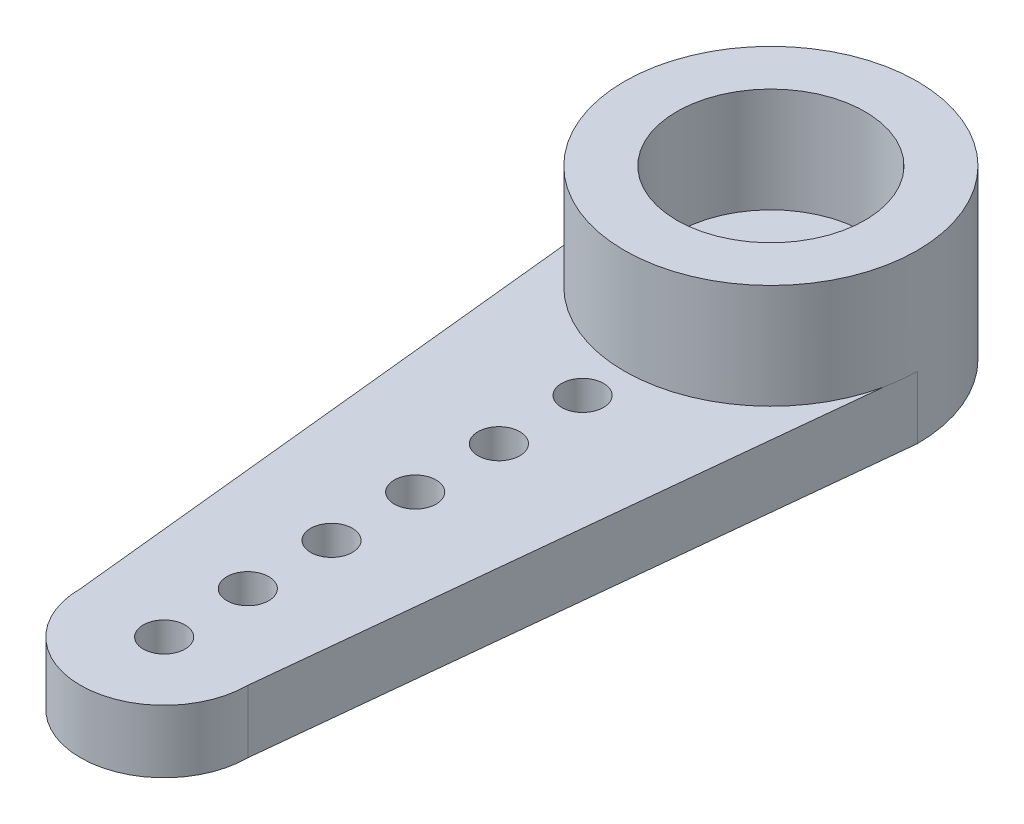
ISO-10303-21;
HEADER;
FILE_DESCRIPTION(('STEP AP214'),'2;1');
FILE_NAME('part.step','',(''),(''),'','','');
FILE_SCHEMA(('AUTOMOTIVE_DESIGN { 1 0 10303 214 1 1 1 1 }'));
ENDSEC;
DATA;
#1=APPLICATION_CONTEXT('core data for automotive mechanical design processes');
#2=APPLICATION_PROTOCOL_DEFINITION('international standard','automotive_design',2000,#1);
#3=PRODUCT_CONTEXT('',#1,'mechanical');
#4=PRODUCT('Part','Part','',(#3));
#5=PRODUCT_RELATED_PRODUCT_CATEGORY('part','',(#4));
#6=PRODUCT_DEFINITION_FORMATION('','',#4);
#7=PRODUCT_DEFINITION_CONTEXT('part definition',#1,'design');
#8=PRODUCT_DEFINITION('design','',#6,#7);
#9=PRODUCT_DEFINITION_SHAPE('','',#8);
#10=(LENGTH_UNIT() NAMED_UNIT(*) SI_UNIT(.MILLI.,.METRE.));
#11=(NAMED_UNIT(*) PLANE_ANGLE_UNIT() SI_UNIT($,.RADIAN.));
#12=(NAMED_UNIT(*) SI_UNIT($,.STERADIAN.) SOLID_ANGLE_UNIT());
#13=UNCERTAINTY_MEASURE_WITH_UNIT(LENGTH_MEASURE(1.E-05),#10,'distance_accuracy_value','');
#14=(GEOMETRIC_REPRESENTATION_CONTEXT(3) GLOBAL_UNCERTAINTY_ASSIGNED_CONTEXT((#13)) GLOBAL_UNIT_ASSIGNED_CONTEXT((#10,
#11,#12)) REPRESENTATION_CONTEXT('',''));
#15=CARTESIAN_POINT('',(0.,0.,0.));
#16=DIRECTION('',(0.,0.,1.));
#17=DIRECTION('',(1.,0.,0.));
#18=AXIS2_PLACEMENT_3D('',#15,#16,#17);
#19=CARTESIAN_POINT('',(0.,1.5,0.));
#20=DIRECTION('',(0.,1.,0.));
#21=DIRECTION('',(0.,0.,1.));
#22=AXIS2_PLACEMENT_3D('',#19,#20,#21);
#23=PLANE('',#22);
#24=CARTESIAN_POINT('',(0.,1.5,0.));
#25=DIRECTION('',(0.,1.,0.));
#26=DIRECTION('',(0.,0.,1.));
#27=AXIS2_PLACEMENT_3D('',#24,#25,#26);
#28=CIRCLE('',#27,3.5);
#29=CARTESIAN_POINT('',(-3.42588235294118,1.5,0.716470588235303));
#30=VERTEX_POINT('',#29);
#31=CARTESIAN_POINT('',(3.42588235294118,1.5,0.716470588235302));
#32=VERTEX_POINT('',#31);
#33=EDGE_CURVE('E11',#30,#32,#28,.T.);
#34=ORIENTED_EDGE('',*,*,#33,.F.);
#35=DIRECTION('',(0.102899151085505,0.,0.994691793826551));
#36=VECTOR('',#35,1.);
#37=CARTESIAN_POINT('',(-3.5,1.5,0.));
#38=LINE('',#37,#36);
#39=CARTESIAN_POINT('',(-2.,1.5,14.5));
#40=VERTEX_POINT('',#39);
#41=EDGE_CURVE('E123',#30,#40,#38,.T.);
#42=ORIENTED_EDGE('',*,*,#41,.T.);
#43=CARTESIAN_POINT('',(0.,1.5,14.5));
#44=DIRECTION('',(0.,1.,0.));
#45=DIRECTION('',(0.,0.,1.));
#46=AXIS2_PLACEMENT_3D('',#43,#44,#45);
#47=CIRCLE('',#46,2.);
#48=CARTESIAN_POINT('',(2.,1.5,14.5));
#49=VERTEX_POINT('',#48);
#50=EDGE_CURVE('E89',#40,#49,#47,.T.);
#51=ORIENTED_EDGE('',*,*,#50,.T.);
#52=DIRECTION('',(0.102899151085505,0.,-0.994691793826551));
#53=VECTOR('',#52,1.);
#54=CARTESIAN_POINT('',(3.5,1.5,0.));
#55=LINE('',#54,#53);
#56=EDGE_CURVE('E86',#49,#32,#55,.T.);
#57=ORIENTED_EDGE('',*,*,#56,.T.);
#58=EDGE_LOOP('',(#34,#42,#51,#57));
#59=FACE_BOUND('',#58,.T.);
#60=CARTESIAN_POINT('',(0.,1.5,6.5));
#61=DIRECTION('',(0.,1.,0.));
#62=DIRECTION('',(0.,0.,1.));
#63=AXIS2_PLACEMENT_3D('',#60,#61,#62);
#64=CIRCLE('',#63,0.5);
#65=CARTESIAN_POINT('',(0.,1.5,7.));
#66=VERTEX_POINT('',#65);
#67=EDGE_CURVE('E167',#66,#66,#64,.T.);
#68=ORIENTED_EDGE('',*,*,#67,.F.);
#69=EDGE_LOOP('',(#68));
#70=FACE_BOUND('',#69,.T.);
#71=CARTESIAN_POINT('',(0.,1.5,10.5));
#72=DIRECTION('',(0.,1.,0.));
#73=DIRECTION('',(0.,0.,1.));
#74=AXIS2_PLACEMENT_3D('',#71,#72,#73);
#75=CIRCLE('',#74,0.5);
#76=CARTESIAN_POINT('',(0.,1.5,11.));
#77=VERTEX_POINT('',#76);
#78=EDGE_CURVE('E155',#77,#77,#75,.T.);
#79=ORIENTED_EDGE('',*,*,#78,.F.);
#80=EDGE_LOOP('',(#79));
#81=FACE_BOUND('',#80,.T.);
#82=CARTESIAN_POINT('',(0.,1.5,14.5));
#83=DIRECTION('',(0.,1.,0.));
#84=DIRECTION('',(0.,0.,1.));
#85=AXIS2_PLACEMENT_3D('',#82,#83,#84);
#86=CIRCLE('',#85,0.5);
#87=CARTESIAN_POINT('',(0.,1.5,15.));
#88=VERTEX_POINT('',#87);
#89=EDGE_CURVE('E145',#88,#88,#86,.T.);
#90=ORIENTED_EDGE('',*,*,#89,.F.);
#91=EDGE_LOOP('',(#90));
#92=FACE_BOUND('',#91,.T.);
#93=CARTESIAN_POINT('',(0.,1.5,12.5));
#94=DIRECTION('',(0.,1.,0.));
#95=DIRECTION('',(0.,0.,1.));
#96=AXIS2_PLACEMENT_3D('',#93,#94,#95);
#97=CIRCLE('',#96,0.5);
#98=CARTESIAN_POINT('',(0.,1.5,13.));
#99=VERTEX_POINT('',#98);
#100=EDGE_CURVE('E150',#99,#99,#97,.T.);
#101=ORIENTED_EDGE('',*,*,#100,.F.);
#102=EDGE_LOOP('',(#101));
#103=FACE_BOUND('',#102,.T.);
#104=CARTESIAN_POINT('',(0.,1.5,8.5));
#105=DIRECTION('',(0.,1.,0.));
#106=DIRECTION('',(0.,0.,1.));
#107=AXIS2_PLACEMENT_3D('',#104,#105,#106);
#108=CIRCLE('',#107,0.5);
#109=CARTESIAN_POINT('',(0.,1.5,9.));
#110=VERTEX_POINT('',#109);
#111=EDGE_CURVE('E161',#110,#110,#108,.T.);
#112=ORIENTED_EDGE('',*,*,#111,.F.);
#113=EDGE_LOOP('',(#112));
#114=FACE_BOUND('',#113,.T.);
#115=CARTESIAN_POINT('',(0.,1.5,4.5));
#116=DIRECTION('',(0.,1.,0.));
#117=DIRECTION('',(0.,0.,1.));
#118=AXIS2_PLACEMENT_3D('',#115,#116,#117);
#119=CIRCLE('',#118,0.5);
#120=CARTESIAN_POINT('',(0.,1.5,5.));
#121=VERTEX_POINT('',#120);
#122=EDGE_CURVE('E173',#121,#121,#119,.T.);
#123=ORIENTED_EDGE('',*,*,#122,.F.);
#124=EDGE_LOOP('',(#123));
#125=FACE_BOUND('',#124,.T.);
#126=ADVANCED_FACE('F32',(#59,#70,#81,#92,#103,#114,#125),#23,.T.);
#127=CARTESIAN_POINT('',(0.,0.,0.));
#128=DIRECTION('',(0.,1.,0.));
#129=DIRECTION('',(0.,0.,1.));
#130=AXIS2_PLACEMENT_3D('',#127,#128,#129);
#131=PLANE('',#130);
#132=CARTESIAN_POINT('',(0.,0.,0.));
#133=DIRECTION('',(0.,-1.,0.));
#134=DIRECTION('',(0.,0.,-1.));
#135=AXIS2_PLACEMENT_3D('',#132,#133,#134);
#136=CIRCLE('',#135,2.5);
#137=CARTESIAN_POINT('',(0.,0.,-2.5));
#138=VERTEX_POINT('',#137);
#139=EDGE_CURVE('E219',#138,#138,#136,.T.);
#140=ORIENTED_EDGE('',*,*,#139,.F.);
#141=EDGE_LOOP('',(#140));
#142=FACE_BOUND('',#141,.T.);
#143=CARTESIAN_POINT('',(0.,0.,6.5));
#144=DIRECTION('',(0.,1.,0.));
#145=DIRECTION('',(0.,0.,1.));
#146=AXIS2_PLACEMENT_3D('',#143,#144,#145);
#147=CIRCLE('',#146,0.5);
#148=CARTESIAN_POINT('',(0.,0.,7.));
#149=VERTEX_POINT('',#148);
#150=EDGE_CURVE('E170',#149,#149,#147,.T.);
#151=ORIENTED_EDGE('',*,*,#150,.T.);
#152=EDGE_LOOP('',(#151));
#153=FACE_BOUND('',#152,.T.);
#154=CARTESIAN_POINT('',(0.,0.,10.5));
#155=DIRECTION('',(0.,1.,0.));
#156=DIRECTION('',(0.,0.,1.));
#157=AXIS2_PLACEMENT_3D('',#154,#155,#156);
#158=CIRCLE('',#157,0.5);
#159=CARTESIAN_POINT('',(0.,0.,11.));
#160=VERTEX_POINT('',#159);
#161=EDGE_CURVE('E158',#160,#160,#158,.T.);
#162=ORIENTED_EDGE('',*,*,#161,.T.);
#163=EDGE_LOOP('',(#162));
#164=FACE_BOUND('',#163,.T.);
#165=CARTESIAN_POINT('',(0.,0.,14.5));
#166=DIRECTION('',(0.,1.,0.));
#167=DIRECTION('',(0.,0.,1.));
#168=AXIS2_PLACEMENT_3D('',#165,#166,#167);
#169=CIRCLE('',#168,0.5);
#170=CARTESIAN_POINT('',(0.,0.,15.));
#171=VERTEX_POINT('',#170);
#172=EDGE_CURVE('E128',#171,#171,#169,.T.);
#173=ORIENTED_EDGE('',*,*,#172,.T.);
#174=EDGE_LOOP('',(#173));
#175=FACE_BOUND('',#174,.T.);
#176=CARTESIAN_POINT('',(0.,0.,0.));
#177=DIRECTION('',(0.,1.,0.));
#178=DIRECTION('',(0.,0.,1.));
#179=AXIS2_PLACEMENT_3D('',#176,#177,#178);
#180=CIRCLE('',#179,3.5);
#181=CARTESIAN_POINT('',(3.5,0.,0.));
#182=VERTEX_POINT('',#181);
#183=CARTESIAN_POINT('',(-3.5,0.,0.));
#184=VERTEX_POINT('',#183);
#185=EDGE_CURVE('E132',#182,#184,#180,.T.);
#186=ORIENTED_EDGE('',*,*,#185,.F.);
#187=DIRECTION('',(0.102899151085505,0.,-0.994691793826551));
#188=VECTOR('',#187,1.);
#189=CARTESIAN_POINT('',(3.5,0.,0.));
#190=LINE('',#189,#188);
#191=CARTESIAN_POINT('',(2.,0.,14.5));
#192=VERTEX_POINT('',#191);
#193=EDGE_CURVE('E76',#192,#182,#190,.T.);
#194=ORIENTED_EDGE('',*,*,#193,.F.);
#195=CARTESIAN_POINT('',(0.,0.,14.5));
#196=DIRECTION('',(0.,1.,0.));
#197=DIRECTION('',(0.,0.,1.));
#198=AXIS2_PLACEMENT_3D('',#195,#196,#197);
#199=CIRCLE('',#198,2.);
#200=CARTESIAN_POINT('',(-2.,0.,14.5));
#201=VERTEX_POINT('',#200);
#202=EDGE_CURVE('E142',#201,#192,#199,.T.);
#203=ORIENTED_EDGE('',*,*,#202,.F.);
#204=DIRECTION('',(0.102899151085505,0.,0.994691793826551));
#205=VECTOR('',#204,1.);
#206=CARTESIAN_POINT('',(-3.5,0.,0.));
#207=LINE('',#206,#205);
#208=EDGE_CURVE('E143',#184,#201,#207,.T.);
#209=ORIENTED_EDGE('',*,*,#208,.F.);
#210=EDGE_LOOP('',(#186,#194,#203,#209));
#211=FACE_BOUND('',#210,.T.);
#212=CARTESIAN_POINT('',(0.,0.,12.5));
#213=DIRECTION('',(0.,1.,0.));
#214=DIRECTION('',(0.,0.,1.));
#215=AXIS2_PLACEMENT_3D('',#212,#213,#214);
#216=CIRCLE('',#215,0.5);
#217=CARTESIAN_POINT('',(0.,0.,13.));
#218=VERTEX_POINT('',#217);
#219=EDGE_CURVE('E152',#218,#218,#216,.T.);
#220=ORIENTED_EDGE('',*,*,#219,.T.);
#221=EDGE_LOOP('',(#220));
#222=FACE_BOUND('',#221,.T.);
#223=CARTESIAN_POINT('',(0.,0.,8.5));
#224=DIRECTION('',(0.,1.,0.));
#225=DIRECTION('',(0.,0.,1.));
#226=AXIS2_PLACEMENT_3D('',#223,#224,#225);
#227=CIRCLE('',#226,0.5);
#228=CARTESIAN_POINT('',(0.,0.,9.));
#229=VERTEX_POINT('',#228);
#230=EDGE_CURVE('E164',#229,#229,#227,.T.);
#231=ORIENTED_EDGE('',*,*,#230,.T.);
#232=EDGE_LOOP('',(#231));
#233=FACE_BOUND('',#232,.T.);
#234=CARTESIAN_POINT('',(0.,0.,4.5));
#235=DIRECTION('',(0.,1.,0.));
#236=DIRECTION('',(0.,0.,1.));
#237=AXIS2_PLACEMENT_3D('',#234,#235,#236);
#238=CIRCLE('',#237,0.5);
#239=CARTESIAN_POINT('',(0.,0.,5.));
#240=VERTEX_POINT('',#239);
#241=EDGE_CURVE('E109',#240,#240,#238,.T.);
#242=ORIENTED_EDGE('',*,*,#241,.T.);
#243=EDGE_LOOP('',(#242));
#244=FACE_BOUND('',#243,.T.);
#245=ADVANCED_FACE('F184',(#142,#153,#164,#175,#211,#222,#233,#244),#131,.F.);
#246=CARTESIAN_POINT('',(0.,1.5,0.));
#247=DIRECTION('',(0.,-1.,0.));
#248=DIRECTION('',(0.,0.,-1.));
#249=AXIS2_PLACEMENT_3D('',#246,#247,#248);
#250=CYLINDRICAL_SURFACE('',#249,3.5);
#251=ORIENTED_EDGE('',*,*,#185,.T.);
#252=DIRECTION('',(0.,-1.,0.));
#253=VECTOR('',#252,1.);
#254=CARTESIAN_POINT('',(-3.5,1.5,0.));
#255=LINE('',#254,#253);
#256=CARTESIAN_POINT('',(-3.5,1.5,0.));
#257=VERTEX_POINT('',#256);
#258=EDGE_CURVE('E41',#257,#184,#255,.T.);
#259=ORIENTED_EDGE('',*,*,#258,.F.);
#260=EDGE_CURVE('E104',#257,#30,#28,.T.);
#261=ORIENTED_EDGE('',*,*,#260,.T.);
#262=ORIENTED_EDGE('',*,*,#33,.T.);
#263=CARTESIAN_POINT('',(3.5,1.5,0.));
#264=VERTEX_POINT('',#263);
#265=EDGE_CURVE('E102',#32,#264,#28,.T.);
#266=ORIENTED_EDGE('',*,*,#265,.T.);
#267=DIRECTION('',(0.,-1.,0.));
#268=VECTOR('',#267,1.);
#269=CARTESIAN_POINT('',(3.5,1.5,0.));
#270=LINE('',#269,#268);
#271=EDGE_CURVE('E56',#264,#182,#270,.T.);
#272=ORIENTED_EDGE('',*,*,#271,.T.);
#273=EDGE_LOOP('',(#251,#259,#261,#262,#266,#272));
#274=FACE_BOUND('',#273,.T.);
#275=CARTESIAN_POINT('',(0.,4.,0.));
#276=DIRECTION('',(0.,1.,0.));
#277=DIRECTION('',(0.,0.,1.));
#278=AXIS2_PLACEMENT_3D('',#275,#276,#277);
#279=CIRCLE('',#278,3.5);
#280=CARTESIAN_POINT('',(0.,4.,3.5));
#281=VERTEX_POINT('',#280);
#282=EDGE_CURVE('E106',#281,#281,#279,.T.);
#283=ORIENTED_EDGE('',*,*,#282,.F.);
#284=EDGE_LOOP('',(#283));
#285=FACE_BOUND('',#284,.T.);
#286=ADVANCED_FACE('F34',(#274,#285),#250,.T.);
#287=CARTESIAN_POINT('',(-3.5,1.5,0.));
#288=DIRECTION('',(0.994691793826551,0.,-0.102899151085505));
#289=DIRECTION('',(-0.102899151085505,0.,-0.994691793826551));
#290=AXIS2_PLACEMENT_3D('',#287,#288,#289);
#291=PLANE('',#290);
#292=ORIENTED_EDGE('',*,*,#208,.T.);
#293=DIRECTION('',(0.,-1.,0.));
#294=VECTOR('',#293,1.);
#295=CARTESIAN_POINT('',(-2.,1.5,14.5));
#296=LINE('',#295,#294);
#297=EDGE_CURVE('E118',#40,#201,#296,.T.);
#298=ORIENTED_EDGE('',*,*,#297,.F.);
#299=ORIENTED_EDGE('',*,*,#41,.F.);
#300=EDGE_CURVE('E82',#257,#30,#38,.T.);
#301=ORIENTED_EDGE('',*,*,#300,.F.);
#302=ORIENTED_EDGE('',*,*,#258,.T.);
#303=EDGE_LOOP('',(#292,#298,#299,#301,#302));
#304=FACE_BOUND('',#303,.T.);
#305=ADVANCED_FACE('F285',(#304),#291,.F.);
#306=CARTESIAN_POINT('',(0.,1.5,14.5));
#307=DIRECTION('',(0.,-1.,0.));
#308=DIRECTION('',(0.,0.,-1.));
#309=AXIS2_PLACEMENT_3D('',#306,#307,#308);
#310=CYLINDRICAL_SURFACE('',#309,2.);
#311=ORIENTED_EDGE('',*,*,#202,.T.);
#312=DIRECTION('',(0.,-1.,0.));
#313=VECTOR('',#312,1.);
#314=CARTESIAN_POINT('',(2.,1.5,14.5));
#315=LINE('',#314,#313);
#316=EDGE_CURVE('E136',#49,#192,#315,.T.);
#317=ORIENTED_EDGE('',*,*,#316,.F.);
#318=ORIENTED_EDGE('',*,*,#50,.F.);
#319=ORIENTED_EDGE('',*,*,#297,.T.);
#320=EDGE_LOOP('',(#311,#317,#318,#319));
#321=FACE_BOUND('',#320,.T.);
#322=ADVANCED_FACE('F279',(#321),#310,.T.);
#323=CARTESIAN_POINT('',(3.5,1.5,0.));
#324=DIRECTION('',(-0.994691793826551,0.,-0.102899151085505));
#325=DIRECTION('',(-0.102899151085505,0.,0.994691793826551));
#326=AXIS2_PLACEMENT_3D('',#323,#324,#325);
#327=PLANE('',#326);
#328=ORIENTED_EDGE('',*,*,#193,.T.);
#329=ORIENTED_EDGE('',*,*,#271,.F.);
#330=EDGE_CURVE('E91',#32,#264,#55,.T.);
#331=ORIENTED_EDGE('',*,*,#330,.F.);
#332=ORIENTED_EDGE('',*,*,#56,.F.);
#333=ORIENTED_EDGE('',*,*,#316,.T.);
#334=EDGE_LOOP('',(#328,#329,#331,#332,#333));
#335=FACE_BOUND('',#334,.T.);
#336=ADVANCED_FACE('F93',(#335),#327,.F.);
#337=CARTESIAN_POINT('',(0.,1.5,14.5));
#338=DIRECTION('',(0.,-1.,0.));
#339=DIRECTION('',(0.,0.,-1.));
#340=AXIS2_PLACEMENT_3D('',#337,#338,#339);
#341=CYLINDRICAL_SURFACE('',#340,0.5);
#342=ORIENTED_EDGE('',*,*,#89,.T.);
#343=EDGE_LOOP('',(#342));
#344=FACE_BOUND('',#343,.T.);
#345=ORIENTED_EDGE('',*,*,#172,.F.);
#346=EDGE_LOOP('',(#345));
#347=FACE_BOUND('',#346,.T.);
#348=ADVANCED_FACE('F273',(#344,#347),#341,.F.);
#349=CARTESIAN_POINT('',(0.,1.5,12.5));
#350=DIRECTION('',(0.,-1.,0.));
#351=DIRECTION('',(0.,0.,-1.));
#352=AXIS2_PLACEMENT_3D('',#349,#350,#351);
#353=CYLINDRICAL_SURFACE('',#352,0.5);
#354=ORIENTED_EDGE('',*,*,#100,.T.);
#355=EDGE_LOOP('',(#354));
#356=FACE_BOUND('',#355,.T.);
#357=ORIENTED_EDGE('',*,*,#219,.F.);
#358=EDGE_LOOP('',(#357));
#359=FACE_BOUND('',#358,.T.);
#360=ADVANCED_FACE('F270',(#356,#359),#353,.F.);
#361=CARTESIAN_POINT('',(0.,1.5,10.5));
#362=DIRECTION('',(0.,-1.,0.));
#363=DIRECTION('',(0.,0.,-1.));
#364=AXIS2_PLACEMENT_3D('',#361,#362,#363);
#365=CYLINDRICAL_SURFACE('',#364,0.5);
#366=ORIENTED_EDGE('',*,*,#78,.T.);
#367=EDGE_LOOP('',(#366));
#368=FACE_BOUND('',#367,.T.);
#369=ORIENTED_EDGE('',*,*,#161,.F.);
#370=EDGE_LOOP('',(#369));
#371=FACE_BOUND('',#370,.T.);
#372=ADVANCED_FACE('F266',(#368,#371),#365,.F.);
#373=CARTESIAN_POINT('',(0.,1.5,8.5));
#374=DIRECTION('',(0.,-1.,0.));
#375=DIRECTION('',(0.,0.,-1.));
#376=AXIS2_PLACEMENT_3D('',#373,#374,#375);
#377=CYLINDRICAL_SURFACE('',#376,0.5);
#378=ORIENTED_EDGE('',*,*,#111,.T.);
#379=EDGE_LOOP('',(#378));
#380=FACE_BOUND('',#379,.T.);
#381=ORIENTED_EDGE('',*,*,#230,.F.);
#382=EDGE_LOOP('',(#381));
#383=FACE_BOUND('',#382,.T.);
#384=ADVANCED_FACE('F259',(#380,#383),#377,.F.);
#385=CARTESIAN_POINT('',(0.,1.5,6.5));
#386=DIRECTION('',(0.,-1.,0.));
#387=DIRECTION('',(0.,0.,-1.));
#388=AXIS2_PLACEMENT_3D('',#385,#386,#387);
#389=CYLINDRICAL_SURFACE('',#388,0.5);
#390=ORIENTED_EDGE('',*,*,#67,.T.);
#391=EDGE_LOOP('',(#390));
#392=FACE_BOUND('',#391,.T.);
#393=ORIENTED_EDGE('',*,*,#150,.F.);
#394=EDGE_LOOP('',(#393));
#395=FACE_BOUND('',#394,.T.);
#396=ADVANCED_FACE('F251',(#392,#395),#389,.F.);
#397=CARTESIAN_POINT('',(0.,1.5,4.5));
#398=DIRECTION('',(0.,-1.,0.));
#399=DIRECTION('',(0.,0.,-1.));
#400=AXIS2_PLACEMENT_3D('',#397,#398,#399);
#401=CYLINDRICAL_SURFACE('',#400,0.5);
#402=ORIENTED_EDGE('',*,*,#122,.T.);
#403=EDGE_LOOP('',(#402));
#404=FACE_BOUND('',#403,.T.);
#405=ORIENTED_EDGE('',*,*,#241,.F.);
#406=EDGE_LOOP('',(#405));
#407=FACE_BOUND('',#406,.T.);
#408=ADVANCED_FACE('F180',(#404,#407),#401,.F.);
#409=CARTESIAN_POINT('',(0.,1.5,0.));
#410=DIRECTION('',(0.,1.,0.));
#411=DIRECTION('',(0.,0.,1.));
#412=AXIS2_PLACEMENT_3D('',#409,#410,#411);
#413=PLANE('',#412);
#414=ORIENTED_EDGE('',*,*,#260,.F.);
#415=ORIENTED_EDGE('',*,*,#300,.T.);
#416=EDGE_LOOP('',(#414,#415));
#417=FACE_BOUND('',#416,.T.);
#418=ADVANCED_FACE('F250',(#417),#413,.F.);
#419=ORIENTED_EDGE('',*,*,#265,.F.);
#420=ORIENTED_EDGE('',*,*,#330,.T.);
#421=EDGE_LOOP('',(#419,#420));
#422=FACE_BOUND('',#421,.T.);
#423=ADVANCED_FACE('F105',(#422),#413,.F.);
#424=CARTESIAN_POINT('',(0.,4.,0.));
#425=DIRECTION('',(0.,1.,0.));
#426=DIRECTION('',(0.,0.,1.));
#427=AXIS2_PLACEMENT_3D('',#424,#425,#426);
#428=PLANE('',#427);
#429=ORIENTED_EDGE('',*,*,#282,.T.);
#430=EDGE_LOOP('',(#429));
#431=FACE_BOUND('',#430,.T.);
#432=CARTESIAN_POINT('',(0.,4.,0.));
#433=DIRECTION('',(0.,1.,0.));
#434=DIRECTION('',(0.,0.,1.));
#435=AXIS2_PLACEMENT_3D('',#432,#433,#434);
#436=CIRCLE('',#435,2.25);
#437=CARTESIAN_POINT('',(0.,4.,2.25));
#438=VERTEX_POINT('',#437);
#439=EDGE_CURVE('E111',#438,#438,#436,.T.);
#440=ORIENTED_EDGE('',*,*,#439,.F.);
#441=EDGE_LOOP('',(#440));
#442=FACE_BOUND('',#441,.T.);
#443=ADVANCED_FACE('F204',(#431,#442),#428,.T.);
#444=CARTESIAN_POINT('',(0.,4.,0.));
#445=DIRECTION('',(0.,-1.,0.));
#446=DIRECTION('',(0.,0.,-1.));
#447=AXIS2_PLACEMENT_3D('',#444,#445,#446);
#448=CYLINDRICAL_SURFACE('',#447,2.25);
#449=ORIENTED_EDGE('',*,*,#439,.T.);
#450=EDGE_LOOP('',(#449));
#451=FACE_BOUND('',#450,.T.);
#452=CARTESIAN_POINT('',(0.,1.5,0.));
#453=DIRECTION('',(0.,1.,0.));
#454=DIRECTION('',(0.,0.,1.));
#455=AXIS2_PLACEMENT_3D('',#452,#453,#454);
#456=CIRCLE('',#455,2.25);
#457=CARTESIAN_POINT('',(0.,1.5,2.25));
#458=VERTEX_POINT('',#457);
#459=EDGE_CURVE('E213',#458,#458,#456,.T.);
#460=ORIENTED_EDGE('',*,*,#459,.F.);
#461=EDGE_LOOP('',(#460));
#462=FACE_BOUND('',#461,.T.);
#463=ADVANCED_FACE('F195',(#451,#462),#448,.F.);
#464=CARTESIAN_POINT('',(0.,1.5,0.));
#465=DIRECTION('',(0.,1.,0.));
#466=DIRECTION('',(0.,0.,1.));
#467=AXIS2_PLACEMENT_3D('',#464,#465,#466);
#468=CIRCLE('',#467,1.);
#469=CARTESIAN_POINT('',(0.,1.5,1.));
#470=VERTEX_POINT('',#469);
#471=EDGE_CURVE('E210',#470,#470,#468,.T.);
#472=ORIENTED_EDGE('',*,*,#471,.F.);
#473=EDGE_LOOP('',(#472));
#474=FACE_BOUND('',#473,.T.);
#475=ORIENTED_EDGE('',*,*,#459,.T.);
#476=EDGE_LOOP('',(#475));
#477=FACE_BOUND('',#476,.T.);
#478=ADVANCED_FACE('F186',(#474,#477),#23,.T.);
#479=CARTESIAN_POINT('',(0.,1.,0.));
#480=DIRECTION('',(0.,-1.,0.));
#481=DIRECTION('',(0.,0.,-1.));
#482=AXIS2_PLACEMENT_3D('',#479,#480,#481);
#483=CYLINDRICAL_SURFACE('',#482,2.5);
#484=CARTESIAN_POINT('',(0.,1.,0.));
#485=DIRECTION('',(0.,-1.,0.));
#486=DIRECTION('',(0.,0.,-1.));
#487=AXIS2_PLACEMENT_3D('',#484,#485,#486);
#488=CIRCLE('',#487,2.5);
#489=CARTESIAN_POINT('',(0.,1.,-2.5));
#490=VERTEX_POINT('',#489);
#491=EDGE_CURVE('E215',#490,#490,#488,.T.);
#492=ORIENTED_EDGE('',*,*,#491,.F.);
#493=EDGE_LOOP('',(#492));
#494=FACE_BOUND('',#493,.T.);
#495=ORIENTED_EDGE('',*,*,#139,.T.);
#496=EDGE_LOOP('',(#495));
#497=FACE_BOUND('',#496,.T.);
#498=ADVANCED_FACE('F194',(#494,#497),#483,.F.);
#499=CARTESIAN_POINT('',(0.,1.,0.));
#500=DIRECTION('',(0.,-1.,0.));
#501=DIRECTION('',(0.,0.,-1.));
#502=AXIS2_PLACEMENT_3D('',#499,#500,#501);
#503=PLANE('',#502);
#504=CARTESIAN_POINT('',(0.,1.,0.));
#505=DIRECTION('',(0.,-1.,0.));
#506=DIRECTION('',(0.,0.,-1.));
#507=AXIS2_PLACEMENT_3D('',#504,#505,#506);
#508=CIRCLE('',#507,1.);
#509=CARTESIAN_POINT('',(0.,1.,-1.));
#510=VERTEX_POINT('',#509);
#511=EDGE_CURVE('E36',#510,#510,#508,.T.);
#512=ORIENTED_EDGE('',*,*,#511,.F.);
#513=EDGE_LOOP('',(#512));
#514=FACE_BOUND('',#513,.T.);
#515=ORIENTED_EDGE('',*,*,#491,.T.);
#516=EDGE_LOOP('',(#515));
#517=FACE_BOUND('',#516,.T.);
#518=ADVANCED_FACE('F201',(#514,#517),#503,.T.);
#519=CARTESIAN_POINT('',(0.,0.5,0.));
#520=DIRECTION('',(0.,1.,0.));
#521=DIRECTION('',(0.,0.,1.));
#522=AXIS2_PLACEMENT_3D('',#519,#520,#521);
#523=CYLINDRICAL_SURFACE('',#522,1.);
#524=ORIENTED_EDGE('',*,*,#511,.T.);
#525=EDGE_LOOP('',(#524));
#526=FACE_BOUND('',#525,.T.);
#527=ORIENTED_EDGE('',*,*,#471,.T.);
#528=EDGE_LOOP('',(#527));
#529=FACE_BOUND('',#528,.T.);
#530=ADVANCED_FACE('F228',(#526,#529),#523,.F.);
#531=CLOSED_SHELL('',(#126,#245,#286,#305,#322,#336,#348,#360,#372,#384,#396,#408,#418,#423,
#443,#463,#478,#498,#518,#530));
#532=MANIFOLD_SOLID_BREP('B2',#531);
#533=ADVANCED_BREP_SHAPE_REPRESENTATION('',(#18,#532),#14);
#534=SHAPE_DEFINITION_REPRESENTATION(#9,#533);
ENDSEC;
END-ISO-10303-21;
